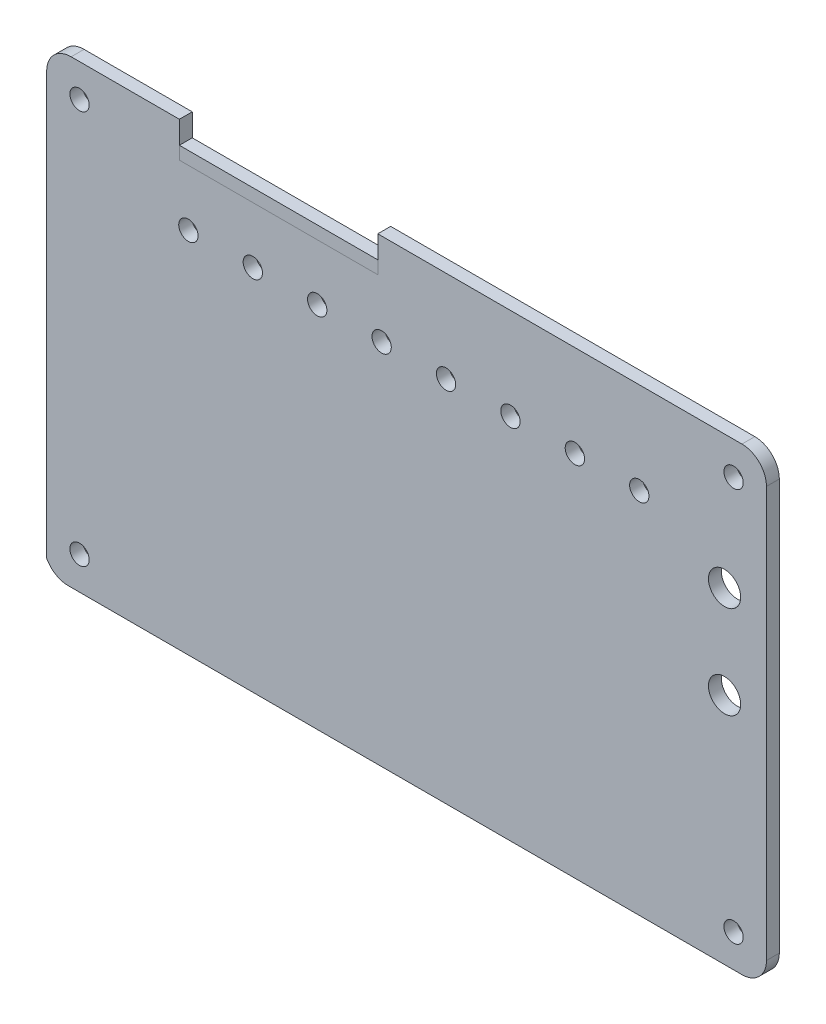
ISO-10303-21;
HEADER;
FILE_DESCRIPTION(('STEP AP214'),'2;1');
FILE_NAME('part.step','',(''),(''),'','','');
FILE_SCHEMA(('AUTOMOTIVE_DESIGN { 1 0 10303 214 1 1 1 1 }'));
ENDSEC;
DATA;
#1=APPLICATION_CONTEXT('core data for automotive mechanical design processes');
#2=APPLICATION_PROTOCOL_DEFINITION('international standard','automotive_design',2000,#1);
#3=PRODUCT_CONTEXT('',#1,'mechanical');
#4=PRODUCT('Part','Part','',(#3));
#5=PRODUCT_RELATED_PRODUCT_CATEGORY('part','',(#4));
#6=PRODUCT_DEFINITION_FORMATION('','',#4);
#7=PRODUCT_DEFINITION_CONTEXT('part definition',#1,'design');
#8=PRODUCT_DEFINITION('design','',#6,#7);
#9=PRODUCT_DEFINITION_SHAPE('','',#8);
#10=(LENGTH_UNIT() NAMED_UNIT(*) SI_UNIT(.MILLI.,.METRE.));
#11=(NAMED_UNIT(*) PLANE_ANGLE_UNIT() SI_UNIT($,.RADIAN.));
#12=(NAMED_UNIT(*) SI_UNIT($,.STERADIAN.) SOLID_ANGLE_UNIT());
#13=UNCERTAINTY_MEASURE_WITH_UNIT(LENGTH_MEASURE(1.E-05),#10,'distance_accuracy_value','');
#14=(GEOMETRIC_REPRESENTATION_CONTEXT(3) GLOBAL_UNCERTAINTY_ASSIGNED_CONTEXT((#13)) GLOBAL_UNIT_ASSIGNED_CONTEXT((#10,
#11,#12)) REPRESENTATION_CONTEXT('',''));
#15=CARTESIAN_POINT('',(0.,0.,0.));
#16=DIRECTION('',(0.,0.,1.));
#17=DIRECTION('',(1.,0.,0.));
#18=AXIS2_PLACEMENT_3D('',#15,#16,#17);
#19=CARTESIAN_POINT('',(-3.96613240239025,29.7904471176475,0.));
#20=DIRECTION('',(1.,0.,0.));
#21=DIRECTION('',(0.,0.,-1.));
#22=AXIS2_PLACEMENT_3D('',#19,#20,#21);
#23=PLANE('',#22);
#24=DIRECTION('',(0.,1.,0.));
#25=VECTOR('',#24,1.);
#26=CARTESIAN_POINT('',(-3.96613240239025,29.7904471176475,2.));
#27=LINE('',#26,#25);
#28=CARTESIAN_POINT('',(-3.96613240239025,29.7904471176475,2.));
#29=VERTEX_POINT('',#28);
#30=CARTESIAN_POINT('',(-3.96613240239025,31.7904471176475,2.));
#31=VERTEX_POINT('',#30);
#32=EDGE_CURVE('E107',#29,#31,#27,.T.);
#33=ORIENTED_EDGE('',*,*,#32,.F.);
#34=DIRECTION('',(0.,0.,1.));
#35=VECTOR('',#34,1.);
#36=CARTESIAN_POINT('',(-3.96613240239025,29.7904471176475,0.));
#37=LINE('',#36,#35);
#38=CARTESIAN_POINT('',(-3.96613240239025,29.7904471176475,0.));
#39=VERTEX_POINT('',#38);
#40=EDGE_CURVE('E12',#39,#29,#37,.T.);
#41=ORIENTED_EDGE('',*,*,#40,.F.);
#42=DIRECTION('',(0.,1.,0.));
#43=VECTOR('',#42,1.);
#44=CARTESIAN_POINT('',(-3.96613240239025,29.7904471176475,0.));
#45=LINE('',#44,#43);
#46=CARTESIAN_POINT('',(-3.96613240239025,31.7904471176475,0.));
#47=VERTEX_POINT('',#46);
#48=EDGE_CURVE('E101',#39,#47,#45,.T.);
#49=ORIENTED_EDGE('',*,*,#48,.T.);
#50=DIRECTION('',(0.,0.,1.));
#51=VECTOR('',#50,1.);
#52=CARTESIAN_POINT('',(-3.96613240239025,31.7904471176475,0.));
#53=LINE('',#52,#51);
#54=EDGE_CURVE('E46',#47,#31,#53,.T.);
#55=ORIENTED_EDGE('',*,*,#54,.T.);
#56=EDGE_LOOP('',(#33,#41,#49,#55));
#57=FACE_BOUND('',#56,.T.);
#58=ADVANCED_FACE('F43',(#57),#23,.T.);
#59=CARTESIAN_POINT('',(-3.96613240239025,29.7904471176475,0.));
#60=DIRECTION('',(0.,-1.,0.));
#61=DIRECTION('',(0.,0.,-1.));
#62=AXIS2_PLACEMENT_3D('',#59,#60,#61);
#63=PLANE('',#62);
#64=DIRECTION('',(1.,0.,0.));
#65=VECTOR('',#64,1.);
#66=CARTESIAN_POINT('',(-3.96613240239025,29.7904471176475,2.));
#67=LINE('',#66,#65);
#68=CARTESIAN_POINT('',(-34.7661324023902,29.7904471176475,2.));
#69=VERTEX_POINT('',#68);
#70=EDGE_CURVE('E103',#69,#29,#67,.T.);
#71=ORIENTED_EDGE('',*,*,#70,.F.);
#72=DIRECTION('',(0.,0.,1.));
#73=VECTOR('',#72,1.);
#74=CARTESIAN_POINT('',(-34.7661324023902,29.7904471176475,0.));
#75=LINE('',#74,#73);
#76=CARTESIAN_POINT('',(-34.7661324023902,29.7904471176475,0.));
#77=VERTEX_POINT('',#76);
#78=EDGE_CURVE('E52',#77,#69,#75,.T.);
#79=ORIENTED_EDGE('',*,*,#78,.F.);
#80=DIRECTION('',(1.,0.,0.));
#81=VECTOR('',#80,1.);
#82=CARTESIAN_POINT('',(-3.96613240239025,29.7904471176475,0.));
#83=LINE('',#82,#81);
#84=EDGE_CURVE('E98',#77,#39,#83,.T.);
#85=ORIENTED_EDGE('',*,*,#84,.T.);
#86=ORIENTED_EDGE('',*,*,#40,.T.);
#87=EDGE_LOOP('',(#71,#79,#85,#86));
#88=FACE_BOUND('',#87,.T.);
#89=ADVANCED_FACE('F117',(#88),#63,.T.);
#90=CARTESIAN_POINT('',(-34.7661324023902,29.7904471176475,0.));
#91=DIRECTION('',(-1.,0.,0.));
#92=DIRECTION('',(0.,0.,1.));
#93=AXIS2_PLACEMENT_3D('',#90,#91,#92);
#94=PLANE('',#93);
#95=DIRECTION('',(0.,-1.,0.));
#96=VECTOR('',#95,1.);
#97=CARTESIAN_POINT('',(-34.7661324023902,29.7904471176475,2.));
#98=LINE('',#97,#96);
#99=CARTESIAN_POINT('',(-34.7661324023902,31.7904471176475,2.));
#100=VERTEX_POINT('',#99);
#101=EDGE_CURVE('E93',#100,#69,#98,.T.);
#102=ORIENTED_EDGE('',*,*,#101,.F.);
#103=DIRECTION('',(0.,0.,1.));
#104=VECTOR('',#103,1.);
#105=CARTESIAN_POINT('',(-34.7661324023902,31.7904471176475,0.));
#106=LINE('',#105,#104);
#107=CARTESIAN_POINT('',(-34.7661324023902,31.7904471176475,0.));
#108=VERTEX_POINT('',#107);
#109=EDGE_CURVE('E88',#108,#100,#106,.T.);
#110=ORIENTED_EDGE('',*,*,#109,.F.);
#111=DIRECTION('',(0.,-1.,0.));
#112=VECTOR('',#111,1.);
#113=CARTESIAN_POINT('',(-34.7661324023902,29.7904471176475,0.));
#114=LINE('',#113,#112);
#115=EDGE_CURVE('E91',#108,#77,#114,.T.);
#116=ORIENTED_EDGE('',*,*,#115,.T.);
#117=ORIENTED_EDGE('',*,*,#78,.T.);
#118=EDGE_LOOP('',(#102,#110,#116,#117));
#119=FACE_BOUND('',#118,.T.);
#120=ADVANCED_FACE('F90',(#119),#94,.T.);
#121=CARTESIAN_POINT('',(-3.96613240239025,31.7904471176475,0.));
#122=DIRECTION('',(0.,1.,0.));
#123=DIRECTION('',(-1.,0.,0.));
#124=AXIS2_PLACEMENT_3D('',#121,#122,#123);
#125=PLANE('',#124);
#126=DIRECTION('',(-1.,0.,0.));
#127=VECTOR('',#126,1.);
#128=CARTESIAN_POINT('',(-3.96613240239025,31.7904471176475,2.));
#129=LINE('',#128,#127);
#130=EDGE_CURVE('E110',#31,#100,#129,.T.);
#131=ORIENTED_EDGE('',*,*,#130,.F.);
#132=ORIENTED_EDGE('',*,*,#54,.F.);
#133=DIRECTION('',(-1.,0.,0.));
#134=VECTOR('',#133,1.);
#135=CARTESIAN_POINT('',(-3.96613240239025,31.7904471176475,0.));
#136=LINE('',#135,#134);
#137=EDGE_CURVE('E97',#47,#108,#136,.T.);
#138=ORIENTED_EDGE('',*,*,#137,.T.);
#139=ORIENTED_EDGE('',*,*,#109,.T.);
#140=EDGE_LOOP('',(#131,#132,#138,#139));
#141=FACE_BOUND('',#140,.T.);
#142=ADVANCED_FACE('F100',(#141),#125,.T.);
#143=CARTESIAN_POINT('',(0.,0.,0.));
#144=DIRECTION('',(0.,0.,1.));
#145=DIRECTION('',(1.,0.,0.));
#146=AXIS2_PLACEMENT_3D('',#143,#144,#145);
#147=PLANE('',#146);
#148=ORIENTED_EDGE('',*,*,#48,.F.);
#149=ORIENTED_EDGE('',*,*,#84,.F.);
#150=ORIENTED_EDGE('',*,*,#115,.F.);
#151=ORIENTED_EDGE('',*,*,#137,.F.);
#152=EDGE_LOOP('',(#148,#149,#150,#151));
#153=FACE_BOUND('',#152,.T.);
#154=ADVANCED_FACE('F96',(#153),#147,.F.);
#155=CARTESIAN_POINT('',(0.,0.,2.));
#156=DIRECTION('',(0.,0.,1.));
#157=DIRECTION('',(1.,0.,0.));
#158=AXIS2_PLACEMENT_3D('',#155,#156,#157);
#159=PLANE('',#158);
#160=ORIENTED_EDGE('',*,*,#32,.T.);
#161=ORIENTED_EDGE('',*,*,#130,.T.);
#162=ORIENTED_EDGE('',*,*,#101,.T.);
#163=ORIENTED_EDGE('',*,*,#70,.T.);
#164=EDGE_LOOP('',(#160,#161,#162,#163));
#165=FACE_BOUND('',#164,.T.);
#166=ADVANCED_FACE('F116',(#165),#159,.T.);
#167=CLOSED_SHELL('',(#58,#89,#120,#142,#154,#166));
#168=MANIFOLD_SOLID_BREP('B2',#167);
#169=CARTESIAN_POINT('',(-52.0194922962539,-32.2495528823525,2.));
#170=DIRECTION('',(0.,0.,1.));
#171=DIRECTION('',(1.,0.,0.));
#172=AXIS2_PLACEMENT_3D('',#169,#170,#171);
#173=PLANE('',#172);
#174=CARTESIAN_POINT('',(49.8738675976098,0.181573060785537,2.));
#175=DIRECTION('',(0.,0.,1.));
#176=DIRECTION('',(1.,0.,0.));
#177=AXIS2_PLACEMENT_3D('',#174,#175,#176);
#178=CIRCLE('',#177,2.5);
#179=CARTESIAN_POINT('',(52.3738675976098,0.181573060785537,2.));
#180=VERTEX_POINT('',#179);
#181=EDGE_CURVE('E325',#180,#180,#178,.T.);
#182=ORIENTED_EDGE('',*,*,#181,.F.);
#183=EDGE_LOOP('',(#182));
#184=FACE_BOUND('',#183,.T.);
#185=CARTESIAN_POINT('',(49.8738675976098,14.5904471176475,2.));
#186=DIRECTION('',(0.,0.,1.));
#187=DIRECTION('',(1.,0.,0.));
#188=AXIS2_PLACEMENT_3D('',#185,#186,#187);
#189=CIRCLE('',#188,2.5);
#190=CARTESIAN_POINT('',(52.3738675976098,14.5904471176475,2.));
#191=VERTEX_POINT('',#190);
#192=EDGE_CURVE('E316',#191,#191,#189,.T.);
#193=ORIENTED_EDGE('',*,*,#192,.F.);
#194=EDGE_LOOP('',(#193));
#195=FACE_BOUND('',#194,.T.);
#196=DIRECTION('',(-1.,0.,0.));
#197=VECTOR('',#196,1.);
#198=CARTESIAN_POINT('',(-33.3661324023902,29.7904471176475,2.));
#199=LINE('',#198,#197);
#200=CARTESIAN_POINT('',(-3.96613240239025,29.7904471176475,2.));
#201=VERTEX_POINT('',#200);
#202=CARTESIAN_POINT('',(-34.7661324023902,29.7904471176475,2.));
#203=VERTEX_POINT('',#202);
#204=EDGE_CURVE('E262',#201,#203,#199,.T.);
#205=ORIENTED_EDGE('',*,*,#204,.T.);
#206=DIRECTION('',(0.,-1.,0.));
#207=VECTOR('',#206,1.);
#208=CARTESIAN_POINT('',(-34.7661324023902,35.2904471176475,2.));
#209=LINE('',#208,#207);
#210=CARTESIAN_POINT('',(-34.7661324023902,35.2904471176475,2.));
#211=VERTEX_POINT('',#210);
#212=EDGE_CURVE('E260',#211,#203,#209,.T.);
#213=ORIENTED_EDGE('',*,*,#212,.F.);
#214=DIRECTION('',(-1.,0.,0.));
#215=VECTOR('',#214,1.);
#216=CARTESIAN_POINT('',(-51.5661324023902,35.2904471176475,2.));
#217=LINE('',#216,#215);
#218=CARTESIAN_POINT('',(-51.5661324023902,35.2904471176475,2.));
#219=VERTEX_POINT('',#218);
#220=EDGE_CURVE('E251',#211,#219,#217,.T.);
#221=ORIENTED_EDGE('',*,*,#220,.T.);
#222=CARTESIAN_POINT('',(-51.5661324023902,31.4904471176475,2.));
#223=DIRECTION('',(0.,0.,1.));
#224=DIRECTION('',(1.,0.,0.));
#225=AXIS2_PLACEMENT_3D('',#222,#223,#224);
#226=CIRCLE('',#225,3.8);
#227=CARTESIAN_POINT('',(-55.3661324023902,31.4904471176475,2.));
#228=VERTEX_POINT('',#227);
#229=EDGE_CURVE('E256',#219,#228,#226,.T.);
#230=ORIENTED_EDGE('',*,*,#229,.T.);
#231=DIRECTION('',(0.,-1.,0.));
#232=VECTOR('',#231,1.);
#233=CARTESIAN_POINT('',(-55.3661324023902,-34.0495528823525,2.));
#234=LINE('',#233,#232);
#235=CARTESIAN_POINT('',(-55.3661324023902,-34.0495528823525,2.));
#236=VERTEX_POINT('',#235);
#237=EDGE_CURVE('E193',#228,#236,#234,.T.);
#238=ORIENTED_EDGE('',*,*,#237,.T.);
#239=CARTESIAN_POINT('',(-52.0194922962539,-32.2495528823525,2.));
#240=DIRECTION('',(0.,0.,1.));
#241=DIRECTION('',(1.,0.,0.));
#242=AXIS2_PLACEMENT_3D('',#239,#240,#241);
#243=CIRCLE('',#242,3.8);
#244=CARTESIAN_POINT('',(-52.0194922962539,-36.0495528823525,2.));
#245=VERTEX_POINT('',#244);
#246=EDGE_CURVE('E302',#236,#245,#243,.T.);
#247=ORIENTED_EDGE('',*,*,#246,.T.);
#248=DIRECTION('',(1.,0.,0.));
#249=VECTOR('',#248,1.);
#250=CARTESIAN_POINT('',(-52.0194922962539,-36.0495528823525,2.));
#251=LINE('',#250,#249);
#252=CARTESIAN_POINT('',(52.5738675976098,-36.0495528823525,2.));
#253=VERTEX_POINT('',#252);
#254=EDGE_CURVE('E234',#245,#253,#251,.T.);
#255=ORIENTED_EDGE('',*,*,#254,.T.);
#256=CARTESIAN_POINT('',(52.5738675976098,-32.2495528823525,2.));
#257=DIRECTION('',(0.,0.,1.));
#258=DIRECTION('',(1.,0.,0.));
#259=AXIS2_PLACEMENT_3D('',#256,#257,#258);
#260=CIRCLE('',#259,3.8);
#261=CARTESIAN_POINT('',(56.3738675976098,-32.2495528823525,2.));
#262=VERTEX_POINT('',#261);
#263=EDGE_CURVE('E419',#253,#262,#260,.T.);
#264=ORIENTED_EDGE('',*,*,#263,.T.);
#265=DIRECTION('',(0.,1.,0.));
#266=VECTOR('',#265,1.);
#267=CARTESIAN_POINT('',(56.3738675976098,31.4904471176475,2.));
#268=LINE('',#267,#266);
#269=CARTESIAN_POINT('',(56.3738675976098,31.4904471176475,2.));
#270=VERTEX_POINT('',#269);
#271=EDGE_CURVE('E421',#262,#270,#268,.T.);
#272=ORIENTED_EDGE('',*,*,#271,.T.);
#273=CARTESIAN_POINT('',(52.5738675976098,31.4904471176475,2.));
#274=DIRECTION('',(0.,0.,1.));
#275=DIRECTION('',(1.,0.,0.));
#276=AXIS2_PLACEMENT_3D('',#273,#274,#275);
#277=CIRCLE('',#276,3.8);
#278=CARTESIAN_POINT('',(52.5738675976098,35.2904471176475,2.));
#279=VERTEX_POINT('',#278);
#280=EDGE_CURVE('E423',#270,#279,#277,.T.);
#281=ORIENTED_EDGE('',*,*,#280,.T.);
#282=DIRECTION('',(-1.,0.,0.));
#283=VECTOR('',#282,1.);
#284=CARTESIAN_POINT('',(-5.36613240239025,35.2904471176475,2.));
#285=LINE('',#284,#283);
#286=CARTESIAN_POINT('',(-3.96613240239025,35.2904471176475,2.));
#287=VERTEX_POINT('',#286);
#288=EDGE_CURVE('E425',#279,#287,#285,.T.);
#289=ORIENTED_EDGE('',*,*,#288,.T.);
#290=DIRECTION('',(0.,1.,0.));
#291=VECTOR('',#290,1.);
#292=CARTESIAN_POINT('',(-3.96613240239025,35.2904471176475,2.));
#293=LINE('',#292,#291);
#294=EDGE_CURVE('E333',#201,#287,#293,.T.);
#295=ORIENTED_EDGE('',*,*,#294,.F.);
#296=EDGE_LOOP('',(#205,#213,#221,#230,#238,#247,#255,#264,#272,#281,#289,#295));
#297=FACE_BOUND('',#296,.T.);
#298=CARTESIAN_POINT('',(-50.2661324023902,30.1904471176475,2.));
#299=DIRECTION('',(0.,0.,1.));
#300=DIRECTION('',(1.,0.,0.));
#301=AXIS2_PLACEMENT_3D('',#298,#299,#300);
#302=CIRCLE('',#301,1.5);
#303=CARTESIAN_POINT('',(-48.7661324023902,30.1904471176475,2.));
#304=VERTEX_POINT('',#303);
#305=EDGE_CURVE('E350',#304,#304,#302,.T.);
#306=ORIENTED_EDGE('',*,*,#305,.F.);
#307=EDGE_LOOP('',(#306));
#308=FACE_BOUND('',#307,.T.);
#309=CARTESIAN_POINT('',(36.6338675976098,21.0619993771424,2.));
#310=DIRECTION('',(0.,0.,1.));
#311=DIRECTION('',(1.,0.,0.));
#312=AXIS2_PLACEMENT_3D('',#309,#310,#311);
#313=CIRCLE('',#312,1.5);
#314=CARTESIAN_POINT('',(38.1338675976098,21.0619993771424,2.));
#315=VERTEX_POINT('',#314);
#316=EDGE_CURVE('E369',#315,#315,#313,.T.);
#317=ORIENTED_EDGE('',*,*,#316,.F.);
#318=EDGE_LOOP('',(#317));
#319=FACE_BOUND('',#318,.T.);
#320=CARTESIAN_POINT('',(26.6338675976098,21.0619993771424,2.));
#321=DIRECTION('',(0.,0.,1.));
#322=DIRECTION('',(1.,0.,0.));
#323=AXIS2_PLACEMENT_3D('',#320,#321,#322);
#324=CIRCLE('',#323,1.5);
#325=CARTESIAN_POINT('',(28.1338675976098,21.0619993771424,2.));
#326=VERTEX_POINT('',#325);
#327=EDGE_CURVE('E368',#326,#326,#324,.T.);
#328=ORIENTED_EDGE('',*,*,#327,.F.);
#329=EDGE_LOOP('',(#328));
#330=FACE_BOUND('',#329,.T.);
#331=CARTESIAN_POINT('',(51.2738675976098,30.1904471176475,2.));
#332=DIRECTION('',(0.,0.,1.));
#333=DIRECTION('',(1.,0.,0.));
#334=AXIS2_PLACEMENT_3D('',#331,#332,#333);
#335=CIRCLE('',#334,1.5);
#336=CARTESIAN_POINT('',(52.7738675976098,30.1904471176475,2.));
#337=VERTEX_POINT('',#336);
#338=EDGE_CURVE('E351',#337,#337,#335,.T.);
#339=ORIENTED_EDGE('',*,*,#338,.F.);
#340=EDGE_LOOP('',(#339));
#341=FACE_BOUND('',#340,.T.);
#342=CARTESIAN_POINT('',(51.2738675976098,-30.9495528823525,2.));
#343=DIRECTION('',(0.,0.,1.));
#344=DIRECTION('',(1.,0.,0.));
#345=AXIS2_PLACEMENT_3D('',#342,#343,#344);
#346=CIRCLE('',#345,1.5);
#347=CARTESIAN_POINT('',(52.7738675976098,-30.9495528823525,2.));
#348=VERTEX_POINT('',#347);
#349=EDGE_CURVE('E357',#348,#348,#346,.T.);
#350=ORIENTED_EDGE('',*,*,#349,.F.);
#351=EDGE_LOOP('',(#350));
#352=FACE_BOUND('',#351,.T.);
#353=CARTESIAN_POINT('',(-50.2661324023902,-30.9495528823525,2.));
#354=DIRECTION('',(0.,0.,1.));
#355=DIRECTION('',(1.,0.,0.));
#356=AXIS2_PLACEMENT_3D('',#353,#354,#355);
#357=CIRCLE('',#356,1.5);
#358=CARTESIAN_POINT('',(-48.7661324023902,-30.9495528823525,2.));
#359=VERTEX_POINT('',#358);
#360=EDGE_CURVE('E344',#359,#359,#357,.T.);
#361=ORIENTED_EDGE('',*,*,#360,.F.);
#362=EDGE_LOOP('',(#361));
#363=FACE_BOUND('',#362,.T.);
#364=CARTESIAN_POINT('',(16.6338675976098,21.0619993771424,2.));
#365=DIRECTION('',(0.,0.,1.));
#366=DIRECTION('',(1.,0.,0.));
#367=AXIS2_PLACEMENT_3D('',#364,#365,#366);
#368=CIRCLE('',#367,1.5);
#369=CARTESIAN_POINT('',(18.1338675976098,21.0619993771424,2.));
#370=VERTEX_POINT('',#369);
#371=EDGE_CURVE('E380',#370,#370,#368,.T.);
#372=ORIENTED_EDGE('',*,*,#371,.F.);
#373=EDGE_LOOP('',(#372));
#374=FACE_BOUND('',#373,.T.);
#375=CARTESIAN_POINT('',(6.63386759760976,21.0619993771424,2.));
#376=DIRECTION('',(0.,0.,1.));
#377=DIRECTION('',(1.,0.,0.));
#378=AXIS2_PLACEMENT_3D('',#375,#376,#377);
#379=CIRCLE('',#378,1.5);
#380=CARTESIAN_POINT('',(8.13386759760976,21.0619993771424,2.));
#381=VERTEX_POINT('',#380);
#382=EDGE_CURVE('E405',#381,#381,#379,.T.);
#383=ORIENTED_EDGE('',*,*,#382,.F.);
#384=EDGE_LOOP('',(#383));
#385=FACE_BOUND('',#384,.T.);
#386=CARTESIAN_POINT('',(-3.36613240239024,21.0619993771424,2.));
#387=DIRECTION('',(0.,0.,1.));
#388=DIRECTION('',(1.,0.,0.));
#389=AXIS2_PLACEMENT_3D('',#386,#387,#388);
#390=CIRCLE('',#389,1.5);
#391=CARTESIAN_POINT('',(-1.86613240239024,21.0619993771424,2.));
#392=VERTEX_POINT('',#391);
#393=EDGE_CURVE('E399',#392,#392,#390,.T.);
#394=ORIENTED_EDGE('',*,*,#393,.F.);
#395=EDGE_LOOP('',(#394));
#396=FACE_BOUND('',#395,.T.);
#397=CARTESIAN_POINT('',(-13.3661324023902,21.0619993771424,2.));
#398=DIRECTION('',(0.,0.,1.));
#399=DIRECTION('',(1.,0.,0.));
#400=AXIS2_PLACEMENT_3D('',#397,#398,#399);
#401=CIRCLE('',#400,1.5);
#402=CARTESIAN_POINT('',(-11.8661324023902,21.0619993771424,2.));
#403=VERTEX_POINT('',#402);
#404=EDGE_CURVE('E393',#403,#403,#401,.T.);
#405=ORIENTED_EDGE('',*,*,#404,.F.);
#406=EDGE_LOOP('',(#405));
#407=FACE_BOUND('',#406,.T.);
#408=CARTESIAN_POINT('',(-23.3661324023902,21.0619993771424,2.));
#409=DIRECTION('',(0.,0.,1.));
#410=DIRECTION('',(1.,0.,0.));
#411=AXIS2_PLACEMENT_3D('',#408,#409,#410);
#412=CIRCLE('',#411,1.5);
#413=CARTESIAN_POINT('',(-21.8661324023902,21.0619993771424,2.));
#414=VERTEX_POINT('',#413);
#415=EDGE_CURVE('E387',#414,#414,#412,.T.);
#416=ORIENTED_EDGE('',*,*,#415,.F.);
#417=EDGE_LOOP('',(#416));
#418=FACE_BOUND('',#417,.T.);
#419=CARTESIAN_POINT('',(-33.3661324023902,21.0619993771424,2.));
#420=DIRECTION('',(0.,0.,1.));
#421=DIRECTION('',(1.,0.,0.));
#422=AXIS2_PLACEMENT_3D('',#419,#420,#421);
#423=CIRCLE('',#422,1.5);
#424=CARTESIAN_POINT('',(-31.8661324023902,21.0619993771424,2.));
#425=VERTEX_POINT('',#424);
#426=EDGE_CURVE('E386',#425,#425,#423,.T.);
#427=ORIENTED_EDGE('',*,*,#426,.F.);
#428=EDGE_LOOP('',(#427));
#429=FACE_BOUND('',#428,.T.);
#430=ADVANCED_FACE('F167',(#184,#195,#297,#308,#319,#330,#341,#352,#363,#374,#385,#396,#407,
#418,#429),#173,.T.);
#431=CARTESIAN_POINT('',(-52.0194922962539,-32.2495528823525,0.));
#432=DIRECTION('',(0.,0.,1.));
#433=DIRECTION('',(1.,0.,0.));
#434=AXIS2_PLACEMENT_3D('',#431,#432,#433);
#435=PLANE('',#434);
#436=CARTESIAN_POINT('',(49.8738675976098,0.181573060785537,0.));
#437=DIRECTION('',(0.,0.,1.));
#438=DIRECTION('',(1.,0.,0.));
#439=AXIS2_PLACEMENT_3D('',#436,#437,#438);
#440=CIRCLE('',#439,2.5);
#441=CARTESIAN_POINT('',(52.3738675976098,0.181573060785537,0.));
#442=VERTEX_POINT('',#441);
#443=EDGE_CURVE('E171',#442,#442,#440,.T.);
#444=ORIENTED_EDGE('',*,*,#443,.T.);
#445=EDGE_LOOP('',(#444));
#446=FACE_BOUND('',#445,.T.);
#447=CARTESIAN_POINT('',(49.8738675976098,14.5904471176475,0.));
#448=DIRECTION('',(0.,0.,1.));
#449=DIRECTION('',(1.,0.,0.));
#450=AXIS2_PLACEMENT_3D('',#447,#448,#449);
#451=CIRCLE('',#450,2.5);
#452=CARTESIAN_POINT('',(52.3738675976098,14.5904471176475,0.));
#453=VERTEX_POINT('',#452);
#454=EDGE_CURVE('E314',#453,#453,#451,.T.);
#455=ORIENTED_EDGE('',*,*,#454,.T.);
#456=EDGE_LOOP('',(#455));
#457=FACE_BOUND('',#456,.T.);
#458=CARTESIAN_POINT('',(-50.2661324023902,30.1904471176475,0.));
#459=DIRECTION('',(0.,0.,1.));
#460=DIRECTION('',(1.,0.,0.));
#461=AXIS2_PLACEMENT_3D('',#458,#459,#460);
#462=CIRCLE('',#461,1.5);
#463=CARTESIAN_POINT('',(-48.7661324023902,30.1904471176475,0.));
#464=VERTEX_POINT('',#463);
#465=EDGE_CURVE('E372',#464,#464,#462,.T.);
#466=ORIENTED_EDGE('',*,*,#465,.T.);
#467=EDGE_LOOP('',(#466));
#468=FACE_BOUND('',#467,.T.);
#469=CARTESIAN_POINT('',(36.6338675976098,21.0619993771424,0.));
#470=DIRECTION('',(0.,0.,1.));
#471=DIRECTION('',(1.,0.,0.));
#472=AXIS2_PLACEMENT_3D('',#469,#470,#471);
#473=CIRCLE('',#472,1.5);
#474=CARTESIAN_POINT('',(38.1338675976098,21.0619993771424,0.));
#475=VERTEX_POINT('',#474);
#476=EDGE_CURVE('E365',#475,#475,#473,.T.);
#477=ORIENTED_EDGE('',*,*,#476,.T.);
#478=EDGE_LOOP('',(#477));
#479=FACE_BOUND('',#478,.T.);
#480=CARTESIAN_POINT('',(26.6338675976098,21.0619993771424,0.));
#481=DIRECTION('',(0.,0.,1.));
#482=DIRECTION('',(1.,0.,0.));
#483=AXIS2_PLACEMENT_3D('',#480,#481,#482);
#484=CIRCLE('',#483,1.5);
#485=CARTESIAN_POINT('',(28.1338675976098,21.0619993771424,0.));
#486=VERTEX_POINT('',#485);
#487=EDGE_CURVE('E377',#486,#486,#484,.T.);
#488=ORIENTED_EDGE('',*,*,#487,.T.);
#489=EDGE_LOOP('',(#488));
#490=FACE_BOUND('',#489,.T.);
#491=CARTESIAN_POINT('',(51.2738675976098,30.1904471176475,0.));
#492=DIRECTION('',(0.,0.,1.));
#493=DIRECTION('',(1.,0.,0.));
#494=AXIS2_PLACEMENT_3D('',#491,#492,#493);
#495=CIRCLE('',#494,1.5);
#496=CARTESIAN_POINT('',(52.7738675976098,30.1904471176475,0.));
#497=VERTEX_POINT('',#496);
#498=EDGE_CURVE('E347',#497,#497,#495,.T.);
#499=ORIENTED_EDGE('',*,*,#498,.T.);
#500=EDGE_LOOP('',(#499));
#501=FACE_BOUND('',#500,.T.);
#502=CARTESIAN_POINT('',(51.2738675976098,-30.9495528823525,0.));
#503=DIRECTION('',(0.,0.,1.));
#504=DIRECTION('',(1.,0.,0.));
#505=AXIS2_PLACEMENT_3D('',#502,#503,#504);
#506=CIRCLE('',#505,1.5);
#507=CARTESIAN_POINT('',(52.7738675976098,-30.9495528823525,0.));
#508=VERTEX_POINT('',#507);
#509=EDGE_CURVE('E354',#508,#508,#506,.T.);
#510=ORIENTED_EDGE('',*,*,#509,.T.);
#511=EDGE_LOOP('',(#510));
#512=FACE_BOUND('',#511,.T.);
#513=CARTESIAN_POINT('',(-50.2661324023902,-30.9495528823525,0.));
#514=DIRECTION('',(0.,0.,1.));
#515=DIRECTION('',(1.,0.,0.));
#516=AXIS2_PLACEMENT_3D('',#513,#514,#515);
#517=CIRCLE('',#516,1.5);
#518=CARTESIAN_POINT('',(-48.7661324023902,-30.9495528823525,0.));
#519=VERTEX_POINT('',#518);
#520=EDGE_CURVE('E360',#519,#519,#517,.T.);
#521=ORIENTED_EDGE('',*,*,#520,.T.);
#522=EDGE_LOOP('',(#521));
#523=FACE_BOUND('',#522,.T.);
#524=CARTESIAN_POINT('',(16.6338675976098,21.0619993771424,0.));
#525=DIRECTION('',(0.,0.,1.));
#526=DIRECTION('',(1.,0.,0.));
#527=AXIS2_PLACEMENT_3D('',#524,#525,#526);
#528=CIRCLE('',#527,1.5);
#529=CARTESIAN_POINT('',(18.1338675976098,21.0619993771424,0.));
#530=VERTEX_POINT('',#529);
#531=EDGE_CURVE('E408',#530,#530,#528,.T.);
#532=ORIENTED_EDGE('',*,*,#531,.T.);
#533=EDGE_LOOP('',(#532));
#534=FACE_BOUND('',#533,.T.);
#535=CARTESIAN_POINT('',(6.63386759760976,21.0619993771424,0.));
#536=DIRECTION('',(0.,0.,1.));
#537=DIRECTION('',(1.,0.,0.));
#538=AXIS2_PLACEMENT_3D('',#535,#536,#537);
#539=CIRCLE('',#538,1.5);
#540=CARTESIAN_POINT('',(8.13386759760976,21.0619993771424,0.));
#541=VERTEX_POINT('',#540);
#542=EDGE_CURVE('E402',#541,#541,#539,.T.);
#543=ORIENTED_EDGE('',*,*,#542,.T.);
#544=EDGE_LOOP('',(#543));
#545=FACE_BOUND('',#544,.T.);
#546=CARTESIAN_POINT('',(-3.36613240239024,21.0619993771424,0.));
#547=DIRECTION('',(0.,0.,1.));
#548=DIRECTION('',(1.,0.,0.));
#549=AXIS2_PLACEMENT_3D('',#546,#547,#548);
#550=CIRCLE('',#549,1.5);
#551=CARTESIAN_POINT('',(-1.86613240239024,21.0619993771424,0.));
#552=VERTEX_POINT('',#551);
#553=EDGE_CURVE('E396',#552,#552,#550,.T.);
#554=ORIENTED_EDGE('',*,*,#553,.T.);
#555=EDGE_LOOP('',(#554));
#556=FACE_BOUND('',#555,.T.);
#557=CARTESIAN_POINT('',(-13.3661324023902,21.0619993771424,0.));
#558=DIRECTION('',(0.,0.,1.));
#559=DIRECTION('',(1.,0.,0.));
#560=AXIS2_PLACEMENT_3D('',#557,#558,#559);
#561=CIRCLE('',#560,1.5);
#562=CARTESIAN_POINT('',(-11.8661324023902,21.0619993771424,0.));
#563=VERTEX_POINT('',#562);
#564=EDGE_CURVE('E390',#563,#563,#561,.T.);
#565=ORIENTED_EDGE('',*,*,#564,.T.);
#566=EDGE_LOOP('',(#565));
#567=FACE_BOUND('',#566,.T.);
#568=CARTESIAN_POINT('',(-23.3661324023902,21.0619993771424,0.));
#569=DIRECTION('',(0.,0.,1.));
#570=DIRECTION('',(1.,0.,0.));
#571=AXIS2_PLACEMENT_3D('',#568,#569,#570);
#572=CIRCLE('',#571,1.5);
#573=CARTESIAN_POINT('',(-21.8661324023902,21.0619993771424,0.));
#574=VERTEX_POINT('',#573);
#575=EDGE_CURVE('E383',#574,#574,#572,.T.);
#576=ORIENTED_EDGE('',*,*,#575,.T.);
#577=EDGE_LOOP('',(#576));
#578=FACE_BOUND('',#577,.T.);
#579=CARTESIAN_POINT('',(-33.3661324023902,21.0619993771424,0.));
#580=DIRECTION('',(0.,0.,1.));
#581=DIRECTION('',(1.,0.,0.));
#582=AXIS2_PLACEMENT_3D('',#579,#580,#581);
#583=CIRCLE('',#582,1.5);
#584=CARTESIAN_POINT('',(-31.8661324023902,21.0619993771424,0.));
#585=VERTEX_POINT('',#584);
#586=EDGE_CURVE('E284',#585,#585,#583,.T.);
#587=ORIENTED_EDGE('',*,*,#586,.T.);
#588=EDGE_LOOP('',(#587));
#589=FACE_BOUND('',#588,.T.);
#590=DIRECTION('',(0.,-1.,0.));
#591=VECTOR('',#590,1.);
#592=CARTESIAN_POINT('',(-34.7661324023902,35.2904471176475,0.));
#593=LINE('',#592,#591);
#594=CARTESIAN_POINT('',(-34.7661324023902,35.2904471176475,0.));
#595=VERTEX_POINT('',#594);
#596=CARTESIAN_POINT('',(-34.7661324023902,29.7904471176475,0.));
#597=VERTEX_POINT('',#596);
#598=EDGE_CURVE('E184',#595,#597,#593,.T.);
#599=ORIENTED_EDGE('',*,*,#598,.T.);
#600=DIRECTION('',(-1.,0.,0.));
#601=VECTOR('',#600,1.);
#602=CARTESIAN_POINT('',(-33.3661324023902,29.7904471176475,0.));
#603=LINE('',#602,#601);
#604=CARTESIAN_POINT('',(-3.96613240239025,29.7904471176475,0.));
#605=VERTEX_POINT('',#604);
#606=EDGE_CURVE('E295',#605,#597,#603,.T.);
#607=ORIENTED_EDGE('',*,*,#606,.F.);
#608=DIRECTION('',(0.,1.,0.));
#609=VECTOR('',#608,1.);
#610=CARTESIAN_POINT('',(-3.96613240239025,35.2904471176475,0.));
#611=LINE('',#610,#609);
#612=CARTESIAN_POINT('',(-3.96613240239025,35.2904471176475,0.));
#613=VERTEX_POINT('',#612);
#614=EDGE_CURVE('E335',#605,#613,#611,.T.);
#615=ORIENTED_EDGE('',*,*,#614,.T.);
#616=DIRECTION('',(-1.,0.,0.));
#617=VECTOR('',#616,1.);
#618=CARTESIAN_POINT('',(-5.36613240239025,35.2904471176475,0.));
#619=LINE('',#618,#617);
#620=CARTESIAN_POINT('',(52.5738675976098,35.2904471176475,0.));
#621=VERTEX_POINT('',#620);
#622=EDGE_CURVE('E292',#621,#613,#619,.T.);
#623=ORIENTED_EDGE('',*,*,#622,.F.);
#624=CARTESIAN_POINT('',(52.5738675976098,31.4904471176475,0.));
#625=DIRECTION('',(0.,0.,1.));
#626=DIRECTION('',(1.,0.,0.));
#627=AXIS2_PLACEMENT_3D('',#624,#625,#626);
#628=CIRCLE('',#627,3.8);
#629=CARTESIAN_POINT('',(56.3738675976098,31.4904471176475,0.));
#630=VERTEX_POINT('',#629);
#631=EDGE_CURVE('E290',#630,#621,#628,.T.);
#632=ORIENTED_EDGE('',*,*,#631,.F.);
#633=DIRECTION('',(0.,1.,0.));
#634=VECTOR('',#633,1.);
#635=CARTESIAN_POINT('',(56.3738675976098,31.4904471176475,0.));
#636=LINE('',#635,#634);
#637=CARTESIAN_POINT('',(56.3738675976098,-32.2495528823525,0.));
#638=VERTEX_POINT('',#637);
#639=EDGE_CURVE('E288',#638,#630,#636,.T.);
#640=ORIENTED_EDGE('',*,*,#639,.F.);
#641=CARTESIAN_POINT('',(52.5738675976098,-32.2495528823525,0.));
#642=DIRECTION('',(0.,0.,1.));
#643=DIRECTION('',(1.,0.,0.));
#644=AXIS2_PLACEMENT_3D('',#641,#642,#643);
#645=CIRCLE('',#644,3.8);
#646=CARTESIAN_POINT('',(52.5738675976098,-36.0495528823525,0.));
#647=VERTEX_POINT('',#646);
#648=EDGE_CURVE('E286',#647,#638,#645,.T.);
#649=ORIENTED_EDGE('',*,*,#648,.F.);
#650=DIRECTION('',(1.,0.,0.));
#651=VECTOR('',#650,1.);
#652=CARTESIAN_POINT('',(48.5238675976098,-36.0495528823525,0.));
#653=LINE('',#652,#651);
#654=CARTESIAN_POINT('',(-52.0194922962539,-36.0495528823525,0.));
#655=VERTEX_POINT('',#654);
#656=EDGE_CURVE('E283',#655,#647,#653,.T.);
#657=ORIENTED_EDGE('',*,*,#656,.F.);
#658=CARTESIAN_POINT('',(-52.0194922962539,-32.2495528823525,0.));
#659=DIRECTION('',(0.,0.,1.));
#660=DIRECTION('',(1.,0.,0.));
#661=AXIS2_PLACEMENT_3D('',#658,#659,#660);
#662=CIRCLE('',#661,3.8);
#663=CARTESIAN_POINT('',(-55.3661324023902,-34.0495528823525,0.));
#664=VERTEX_POINT('',#663);
#665=EDGE_CURVE('E280',#664,#655,#662,.T.);
#666=ORIENTED_EDGE('',*,*,#665,.F.);
#667=DIRECTION('',(0.,-1.,0.));
#668=VECTOR('',#667,1.);
#669=CARTESIAN_POINT('',(-55.3661324023902,-34.0495528823525,0.));
#670=LINE('',#669,#668);
#671=CARTESIAN_POINT('',(-55.3661324023902,31.4904471176475,0.));
#672=VERTEX_POINT('',#671);
#673=EDGE_CURVE('E226',#672,#664,#670,.T.);
#674=ORIENTED_EDGE('',*,*,#673,.F.);
#675=CARTESIAN_POINT('',(-51.5661324023902,31.4904471176475,0.));
#676=DIRECTION('',(0.,0.,1.));
#677=DIRECTION('',(1.,0.,0.));
#678=AXIS2_PLACEMENT_3D('',#675,#676,#677);
#679=CIRCLE('',#678,3.8);
#680=CARTESIAN_POINT('',(-51.5661324023902,35.2904471176475,0.));
#681=VERTEX_POINT('',#680);
#682=EDGE_CURVE('E299',#681,#672,#679,.T.);
#683=ORIENTED_EDGE('',*,*,#682,.F.);
#684=DIRECTION('',(-1.,0.,0.));
#685=VECTOR('',#684,1.);
#686=CARTESIAN_POINT('',(-51.5661324023902,35.2904471176475,0.));
#687=LINE('',#686,#685);
#688=EDGE_CURVE('E268',#595,#681,#687,.T.);
#689=ORIENTED_EDGE('',*,*,#688,.F.);
#690=EDGE_LOOP('',(#599,#607,#615,#623,#632,#640,#649,#657,#666,#674,#683,#689));
#691=FACE_BOUND('',#690,.T.);
#692=ADVANCED_FACE('F440',(#446,#457,#468,#479,#490,#501,#512,#523,#534,#545,#556,#567,#578,
#589,#691),#435,.F.);
#693=CARTESIAN_POINT('',(-52.0194922962539,-32.2495528823525,2.));
#694=DIRECTION('',(0.,0.,-1.));
#695=DIRECTION('',(-1.,0.,0.));
#696=AXIS2_PLACEMENT_3D('',#693,#694,#695);
#697=CYLINDRICAL_SURFACE('',#696,3.8);
#698=ORIENTED_EDGE('',*,*,#665,.T.);
#699=DIRECTION('',(0.,0.,-1.));
#700=VECTOR('',#699,1.);
#701=CARTESIAN_POINT('',(-52.0194922962539,-36.0495528823525,2.));
#702=LINE('',#701,#700);
#703=EDGE_CURVE('E41',#245,#655,#702,.T.);
#704=ORIENTED_EDGE('',*,*,#703,.F.);
#705=ORIENTED_EDGE('',*,*,#246,.F.);
#706=DIRECTION('',(0.,0.,-1.));
#707=VECTOR('',#706,1.);
#708=CARTESIAN_POINT('',(-55.3661324023902,-34.0495528823525,2.));
#709=LINE('',#708,#707);
#710=EDGE_CURVE('E276',#236,#664,#709,.T.);
#711=ORIENTED_EDGE('',*,*,#710,.T.);
#712=EDGE_LOOP('',(#698,#704,#705,#711));
#713=FACE_BOUND('',#712,.T.);
#714=ADVANCED_FACE('F169',(#713),#697,.T.);
#715=CARTESIAN_POINT('',(48.5238675976098,-36.0495528823525,2.));
#716=DIRECTION('',(0.,1.,0.));
#717=DIRECTION('',(0.,0.,1.));
#718=AXIS2_PLACEMENT_3D('',#715,#716,#717);
#719=PLANE('',#718);
#720=ORIENTED_EDGE('',*,*,#656,.T.);
#721=DIRECTION('',(0.,0.,-1.));
#722=VECTOR('',#721,1.);
#723=CARTESIAN_POINT('',(52.5738675976098,-36.0495528823525,2.));
#724=LINE('',#723,#722);
#725=EDGE_CURVE('E176',#253,#647,#724,.T.);
#726=ORIENTED_EDGE('',*,*,#725,.F.);
#727=ORIENTED_EDGE('',*,*,#254,.F.);
#728=ORIENTED_EDGE('',*,*,#703,.T.);
#729=EDGE_LOOP('',(#720,#726,#727,#728));
#730=FACE_BOUND('',#729,.T.);
#731=ADVANCED_FACE('F448',(#730),#719,.F.);
#732=CARTESIAN_POINT('',(52.5738675976098,-32.2495528823525,2.));
#733=DIRECTION('',(0.,0.,-1.));
#734=DIRECTION('',(-1.,0.,0.));
#735=AXIS2_PLACEMENT_3D('',#732,#733,#734);
#736=CYLINDRICAL_SURFACE('',#735,3.8);
#737=ORIENTED_EDGE('',*,*,#648,.T.);
#738=DIRECTION('',(0.,0.,-1.));
#739=VECTOR('',#738,1.);
#740=CARTESIAN_POINT('',(56.3738675976098,-32.2495528823525,2.));
#741=LINE('',#740,#739);
#742=EDGE_CURVE('E310',#262,#638,#741,.T.);
#743=ORIENTED_EDGE('',*,*,#742,.F.);
#744=ORIENTED_EDGE('',*,*,#263,.F.);
#745=ORIENTED_EDGE('',*,*,#725,.T.);
#746=EDGE_LOOP('',(#737,#743,#744,#745));
#747=FACE_BOUND('',#746,.T.);
#748=ADVANCED_FACE('F451',(#747),#736,.T.);
#749=CARTESIAN_POINT('',(56.3738675976098,31.4904471176475,2.));
#750=DIRECTION('',(-1.,0.,0.));
#751=DIRECTION('',(0.,-1.,0.));
#752=AXIS2_PLACEMENT_3D('',#749,#750,#751);
#753=PLANE('',#752);
#754=ORIENTED_EDGE('',*,*,#639,.T.);
#755=DIRECTION('',(0.,0.,-1.));
#756=VECTOR('',#755,1.);
#757=CARTESIAN_POINT('',(56.3738675976098,31.4904471176475,2.));
#758=LINE('',#757,#756);
#759=EDGE_CURVE('E307',#270,#630,#758,.T.);
#760=ORIENTED_EDGE('',*,*,#759,.F.);
#761=ORIENTED_EDGE('',*,*,#271,.F.);
#762=ORIENTED_EDGE('',*,*,#742,.T.);
#763=EDGE_LOOP('',(#754,#760,#761,#762));
#764=FACE_BOUND('',#763,.T.);
#765=ADVANCED_FACE('F456',(#764),#753,.F.);
#766=CARTESIAN_POINT('',(52.5738675976098,31.4904471176475,2.));
#767=DIRECTION('',(0.,0.,-1.));
#768=DIRECTION('',(-1.,0.,0.));
#769=AXIS2_PLACEMENT_3D('',#766,#767,#768);
#770=CYLINDRICAL_SURFACE('',#769,3.8);
#771=ORIENTED_EDGE('',*,*,#631,.T.);
#772=DIRECTION('',(0.,0.,-1.));
#773=VECTOR('',#772,1.);
#774=CARTESIAN_POINT('',(52.5738675976098,35.2904471176475,2.));
#775=LINE('',#774,#773);
#776=EDGE_CURVE('E271',#279,#621,#775,.T.);
#777=ORIENTED_EDGE('',*,*,#776,.F.);
#778=ORIENTED_EDGE('',*,*,#280,.F.);
#779=ORIENTED_EDGE('',*,*,#759,.T.);
#780=EDGE_LOOP('',(#771,#777,#778,#779));
#781=FACE_BOUND('',#780,.T.);
#782=ADVANCED_FACE('F461',(#781),#770,.T.);
#783=CARTESIAN_POINT('',(-5.36613240239025,35.2904471176475,2.));
#784=DIRECTION('',(0.,-1.,0.));
#785=DIRECTION('',(0.,0.,-1.));
#786=AXIS2_PLACEMENT_3D('',#783,#784,#785);
#787=PLANE('',#786);
#788=ORIENTED_EDGE('',*,*,#622,.T.);
#789=DIRECTION('',(0.,0.,1.));
#790=VECTOR('',#789,1.);
#791=CARTESIAN_POINT('',(-3.96613240239025,35.2904471176475,0.));
#792=LINE('',#791,#790);
#793=EDGE_CURVE('E341',#613,#287,#792,.T.);
#794=ORIENTED_EDGE('',*,*,#793,.T.);
#795=ORIENTED_EDGE('',*,*,#288,.F.);
#796=ORIENTED_EDGE('',*,*,#776,.T.);
#797=EDGE_LOOP('',(#788,#794,#795,#796));
#798=FACE_BOUND('',#797,.T.);
#799=ADVANCED_FACE('F465',(#798),#787,.F.);
#800=CARTESIAN_POINT('',(-33.3661324023902,29.7904471176475,2.));
#801=DIRECTION('',(0.,-1.,0.));
#802=DIRECTION('',(0.,0.,-1.));
#803=AXIS2_PLACEMENT_3D('',#800,#801,#802);
#804=PLANE('',#803);
#805=ORIENTED_EDGE('',*,*,#606,.T.);
#806=DIRECTION('',(0.,0.,1.));
#807=VECTOR('',#806,1.);
#808=CARTESIAN_POINT('',(-34.7661324023902,29.7904471176475,0.));
#809=LINE('',#808,#807);
#810=EDGE_CURVE('E330',#597,#203,#809,.T.);
#811=ORIENTED_EDGE('',*,*,#810,.T.);
#812=ORIENTED_EDGE('',*,*,#204,.F.);
#813=DIRECTION('',(0.,0.,1.));
#814=VECTOR('',#813,1.);
#815=CARTESIAN_POINT('',(-3.96613240239025,29.7904471176475,0.));
#816=LINE('',#815,#814);
#817=EDGE_CURVE('E338',#605,#201,#816,.T.);
#818=ORIENTED_EDGE('',*,*,#817,.F.);
#819=EDGE_LOOP('',(#805,#811,#812,#818));
#820=FACE_BOUND('',#819,.T.);
#821=ADVANCED_FACE('F435',(#820),#804,.F.);
#822=CARTESIAN_POINT('',(-51.5661324023902,35.2904471176475,2.));
#823=DIRECTION('',(0.,-1.,0.));
#824=DIRECTION('',(0.,0.,-1.));
#825=AXIS2_PLACEMENT_3D('',#822,#823,#824);
#826=PLANE('',#825);
#827=ORIENTED_EDGE('',*,*,#220,.F.);
#828=DIRECTION('',(0.,0.,1.));
#829=VECTOR('',#828,1.);
#830=CARTESIAN_POINT('',(-34.7661324023902,35.2904471176475,0.));
#831=LINE('',#830,#829);
#832=EDGE_CURVE('E328',#595,#211,#831,.T.);
#833=ORIENTED_EDGE('',*,*,#832,.F.);
#834=ORIENTED_EDGE('',*,*,#688,.T.);
#835=DIRECTION('',(0.,0.,-1.));
#836=VECTOR('',#835,1.);
#837=CARTESIAN_POINT('',(-51.5661324023902,35.2904471176475,2.));
#838=LINE('',#837,#836);
#839=EDGE_CURVE('E265',#219,#681,#838,.T.);
#840=ORIENTED_EDGE('',*,*,#839,.F.);
#841=EDGE_LOOP('',(#827,#833,#834,#840));
#842=FACE_BOUND('',#841,.T.);
#843=ADVANCED_FACE('F266',(#842),#826,.F.);
#844=CARTESIAN_POINT('',(-51.5661324023902,31.4904471176475,2.));
#845=DIRECTION('',(0.,0.,-1.));
#846=DIRECTION('',(-1.,0.,0.));
#847=AXIS2_PLACEMENT_3D('',#844,#845,#846);
#848=CYLINDRICAL_SURFACE('',#847,3.8);
#849=ORIENTED_EDGE('',*,*,#682,.T.);
#850=DIRECTION('',(0.,0.,-1.));
#851=VECTOR('',#850,1.);
#852=CARTESIAN_POINT('',(-55.3661324023902,31.4904471176475,2.));
#853=LINE('',#852,#851);
#854=EDGE_CURVE('E272',#228,#672,#853,.T.);
#855=ORIENTED_EDGE('',*,*,#854,.F.);
#856=ORIENTED_EDGE('',*,*,#229,.F.);
#857=ORIENTED_EDGE('',*,*,#839,.T.);
#858=EDGE_LOOP('',(#849,#855,#856,#857));
#859=FACE_BOUND('',#858,.T.);
#860=ADVANCED_FACE('F274',(#859),#848,.T.);
#861=CARTESIAN_POINT('',(-55.3661324023902,-34.0495528823525,2.));
#862=DIRECTION('',(1.,0.,0.));
#863=DIRECTION('',(0.,1.,0.));
#864=AXIS2_PLACEMENT_3D('',#861,#862,#863);
#865=PLANE('',#864);
#866=ORIENTED_EDGE('',*,*,#673,.T.);
#867=ORIENTED_EDGE('',*,*,#710,.F.);
#868=ORIENTED_EDGE('',*,*,#237,.F.);
#869=ORIENTED_EDGE('',*,*,#854,.T.);
#870=EDGE_LOOP('',(#866,#867,#868,#869));
#871=FACE_BOUND('',#870,.T.);
#872=ADVANCED_FACE('F442',(#871),#865,.F.);
#873=CARTESIAN_POINT('',(-33.3661324023902,21.0619993771424,0.));
#874=DIRECTION('',(0.,0.,1.));
#875=DIRECTION('',(1.,0.,0.));
#876=AXIS2_PLACEMENT_3D('',#873,#874,#875);
#877=CYLINDRICAL_SURFACE('',#876,1.5);
#878=ORIENTED_EDGE('',*,*,#586,.F.);
#879=EDGE_LOOP('',(#878));
#880=FACE_BOUND('',#879,.T.);
#881=ORIENTED_EDGE('',*,*,#426,.T.);
#882=EDGE_LOOP('',(#881));
#883=FACE_BOUND('',#882,.T.);
#884=ADVANCED_FACE('F500',(#880,#883),#877,.F.);
#885=CARTESIAN_POINT('',(-23.3661324023902,21.0619993771424,0.));
#886=DIRECTION('',(0.,0.,1.));
#887=DIRECTION('',(1.,0.,0.));
#888=AXIS2_PLACEMENT_3D('',#885,#886,#887);
#889=CYLINDRICAL_SURFACE('',#888,1.5);
#890=ORIENTED_EDGE('',*,*,#575,.F.);
#891=EDGE_LOOP('',(#890));
#892=FACE_BOUND('',#891,.T.);
#893=ORIENTED_EDGE('',*,*,#415,.T.);
#894=EDGE_LOOP('',(#893));
#895=FACE_BOUND('',#894,.T.);
#896=ADVANCED_FACE('F584',(#892,#895),#889,.F.);
#897=CARTESIAN_POINT('',(-13.3661324023902,21.0619993771424,0.));
#898=DIRECTION('',(0.,0.,1.));
#899=DIRECTION('',(1.,0.,0.));
#900=AXIS2_PLACEMENT_3D('',#897,#898,#899);
#901=CYLINDRICAL_SURFACE('',#900,1.5);
#902=ORIENTED_EDGE('',*,*,#564,.F.);
#903=EDGE_LOOP('',(#902));
#904=FACE_BOUND('',#903,.T.);
#905=ORIENTED_EDGE('',*,*,#404,.T.);
#906=EDGE_LOOP('',(#905));
#907=FACE_BOUND('',#906,.T.);
#908=ADVANCED_FACE('F590',(#904,#907),#901,.F.);
#909=CARTESIAN_POINT('',(-3.36613240239024,21.0619993771424,0.));
#910=DIRECTION('',(0.,0.,1.));
#911=DIRECTION('',(1.,0.,0.));
#912=AXIS2_PLACEMENT_3D('',#909,#910,#911);
#913=CYLINDRICAL_SURFACE('',#912,1.5);
#914=ORIENTED_EDGE('',*,*,#553,.F.);
#915=EDGE_LOOP('',(#914));
#916=FACE_BOUND('',#915,.T.);
#917=ORIENTED_EDGE('',*,*,#393,.T.);
#918=EDGE_LOOP('',(#917));
#919=FACE_BOUND('',#918,.T.);
#920=ADVANCED_FACE('F596',(#916,#919),#913,.F.);
#921=CARTESIAN_POINT('',(6.63386759760976,21.0619993771424,0.));
#922=DIRECTION('',(0.,0.,1.));
#923=DIRECTION('',(1.,0.,0.));
#924=AXIS2_PLACEMENT_3D('',#921,#922,#923);
#925=CYLINDRICAL_SURFACE('',#924,1.5);
#926=ORIENTED_EDGE('',*,*,#542,.F.);
#927=EDGE_LOOP('',(#926));
#928=FACE_BOUND('',#927,.T.);
#929=ORIENTED_EDGE('',*,*,#382,.T.);
#930=EDGE_LOOP('',(#929));
#931=FACE_BOUND('',#930,.T.);
#932=ADVANCED_FACE('F605',(#928,#931),#925,.F.);
#933=CARTESIAN_POINT('',(16.6338675976098,21.0619993771424,0.));
#934=DIRECTION('',(0.,0.,1.));
#935=DIRECTION('',(1.,0.,0.));
#936=AXIS2_PLACEMENT_3D('',#933,#934,#935);
#937=CYLINDRICAL_SURFACE('',#936,1.5);
#938=ORIENTED_EDGE('',*,*,#531,.F.);
#939=EDGE_LOOP('',(#938));
#940=FACE_BOUND('',#939,.T.);
#941=ORIENTED_EDGE('',*,*,#371,.T.);
#942=EDGE_LOOP('',(#941));
#943=FACE_BOUND('',#942,.T.);
#944=ADVANCED_FACE('F608',(#940,#943),#937,.F.);
#945=CARTESIAN_POINT('',(-50.2661324023902,-30.9495528823525,0.));
#946=DIRECTION('',(0.,0.,1.));
#947=DIRECTION('',(1.,0.,0.));
#948=AXIS2_PLACEMENT_3D('',#945,#946,#947);
#949=CYLINDRICAL_SURFACE('',#948,1.5);
#950=ORIENTED_EDGE('',*,*,#520,.F.);
#951=EDGE_LOOP('',(#950));
#952=FACE_BOUND('',#951,.T.);
#953=ORIENTED_EDGE('',*,*,#360,.T.);
#954=EDGE_LOOP('',(#953));
#955=FACE_BOUND('',#954,.T.);
#956=ADVANCED_FACE('F611',(#952,#955),#949,.F.);
#957=CARTESIAN_POINT('',(51.2738675976098,-30.9495528823525,0.));
#958=DIRECTION('',(0.,0.,1.));
#959=DIRECTION('',(1.,0.,0.));
#960=AXIS2_PLACEMENT_3D('',#957,#958,#959);
#961=CYLINDRICAL_SURFACE('',#960,1.5);
#962=ORIENTED_EDGE('',*,*,#509,.F.);
#963=EDGE_LOOP('',(#962));
#964=FACE_BOUND('',#963,.T.);
#965=ORIENTED_EDGE('',*,*,#349,.T.);
#966=EDGE_LOOP('',(#965));
#967=FACE_BOUND('',#966,.T.);
#968=ADVANCED_FACE('F616',(#964,#967),#961,.F.);
#969=CARTESIAN_POINT('',(51.2738675976098,30.1904471176475,0.));
#970=DIRECTION('',(0.,0.,1.));
#971=DIRECTION('',(1.,0.,0.));
#972=AXIS2_PLACEMENT_3D('',#969,#970,#971);
#973=CYLINDRICAL_SURFACE('',#972,1.5);
#974=ORIENTED_EDGE('',*,*,#498,.F.);
#975=EDGE_LOOP('',(#974));
#976=FACE_BOUND('',#975,.T.);
#977=ORIENTED_EDGE('',*,*,#338,.T.);
#978=EDGE_LOOP('',(#977));
#979=FACE_BOUND('',#978,.T.);
#980=ADVANCED_FACE('F636',(#976,#979),#973,.F.);
#981=CARTESIAN_POINT('',(26.6338675976098,21.0619993771424,0.));
#982=DIRECTION('',(0.,0.,1.));
#983=DIRECTION('',(1.,0.,0.));
#984=AXIS2_PLACEMENT_3D('',#981,#982,#983);
#985=CYLINDRICAL_SURFACE('',#984,1.5);
#986=ORIENTED_EDGE('',*,*,#487,.F.);
#987=EDGE_LOOP('',(#986));
#988=FACE_BOUND('',#987,.T.);
#989=ORIENTED_EDGE('',*,*,#327,.T.);
#990=EDGE_LOOP('',(#989));
#991=FACE_BOUND('',#990,.T.);
#992=ADVANCED_FACE('F601',(#988,#991),#985,.F.);
#993=CARTESIAN_POINT('',(36.6338675976098,21.0619993771424,0.));
#994=DIRECTION('',(0.,0.,1.));
#995=DIRECTION('',(1.,0.,0.));
#996=AXIS2_PLACEMENT_3D('',#993,#994,#995);
#997=CYLINDRICAL_SURFACE('',#996,1.5);
#998=ORIENTED_EDGE('',*,*,#476,.F.);
#999=EDGE_LOOP('',(#998));
#1000=FACE_BOUND('',#999,.T.);
#1001=ORIENTED_EDGE('',*,*,#316,.T.);
#1002=EDGE_LOOP('',(#1001));
#1003=FACE_BOUND('',#1002,.T.);
#1004=ADVANCED_FACE('F484',(#1000,#1003),#997,.F.);
#1005=CARTESIAN_POINT('',(-50.2661324023902,30.1904471176475,0.));
#1006=DIRECTION('',(0.,0.,1.));
#1007=DIRECTION('',(1.,0.,0.));
#1008=AXIS2_PLACEMENT_3D('',#1005,#1006,#1007);
#1009=CYLINDRICAL_SURFACE('',#1008,1.5);
#1010=ORIENTED_EDGE('',*,*,#465,.F.);
#1011=EDGE_LOOP('',(#1010));
#1012=FACE_BOUND('',#1011,.T.);
#1013=ORIENTED_EDGE('',*,*,#305,.T.);
#1014=EDGE_LOOP('',(#1013));
#1015=FACE_BOUND('',#1014,.T.);
#1016=ADVANCED_FACE('F475',(#1012,#1015),#1009,.F.);
#1017=CARTESIAN_POINT('',(-3.96613240239025,35.2904471176475,0.));
#1018=DIRECTION('',(1.,0.,0.));
#1019=DIRECTION('',(0.,1.,0.));
#1020=AXIS2_PLACEMENT_3D('',#1017,#1018,#1019);
#1021=PLANE('',#1020);
#1022=ORIENTED_EDGE('',*,*,#294,.T.);
#1023=ORIENTED_EDGE('',*,*,#793,.F.);
#1024=ORIENTED_EDGE('',*,*,#614,.F.);
#1025=ORIENTED_EDGE('',*,*,#817,.T.);
#1026=EDGE_LOOP('',(#1022,#1023,#1024,#1025));
#1027=FACE_BOUND('',#1026,.T.);
#1028=ADVANCED_FACE('F470',(#1027),#1021,.F.);
#1029=CARTESIAN_POINT('',(-34.7661324023902,35.2904471176475,0.));
#1030=DIRECTION('',(-1.,0.,0.));
#1031=DIRECTION('',(0.,0.,1.));
#1032=AXIS2_PLACEMENT_3D('',#1029,#1030,#1031);
#1033=PLANE('',#1032);
#1034=ORIENTED_EDGE('',*,*,#212,.T.);
#1035=ORIENTED_EDGE('',*,*,#810,.F.);
#1036=ORIENTED_EDGE('',*,*,#598,.F.);
#1037=ORIENTED_EDGE('',*,*,#832,.T.);
#1038=EDGE_LOOP('',(#1034,#1035,#1036,#1037));
#1039=FACE_BOUND('',#1038,.T.);
#1040=ADVANCED_FACE('F437',(#1039),#1033,.F.);
#1041=CARTESIAN_POINT('',(49.8738675976098,14.5904471176475,-8.));
#1042=DIRECTION('',(0.,0.,1.));
#1043=DIRECTION('',(1.,0.,0.));
#1044=AXIS2_PLACEMENT_3D('',#1041,#1042,#1043);
#1045=CYLINDRICAL_SURFACE('',#1044,2.5);
#1046=ORIENTED_EDGE('',*,*,#192,.T.);
#1047=EDGE_LOOP('',(#1046));
#1048=FACE_BOUND('',#1047,.T.);
#1049=ORIENTED_EDGE('',*,*,#454,.F.);
#1050=EDGE_LOOP('',(#1049));
#1051=FACE_BOUND('',#1050,.T.);
#1052=ADVANCED_FACE('F481',(#1048,#1051),#1045,.F.);
#1053=CARTESIAN_POINT('',(49.8738675976098,0.181573060785537,-8.));
#1054=DIRECTION('',(0.,0.,1.));
#1055=DIRECTION('',(1.,0.,0.));
#1056=AXIS2_PLACEMENT_3D('',#1053,#1054,#1055);
#1057=CYLINDRICAL_SURFACE('',#1056,2.5);
#1058=ORIENTED_EDGE('',*,*,#181,.T.);
#1059=EDGE_LOOP('',(#1058));
#1060=FACE_BOUND('',#1059,.T.);
#1061=ORIENTED_EDGE('',*,*,#443,.F.);
#1062=EDGE_LOOP('',(#1061));
#1063=FACE_BOUND('',#1062,.T.);
#1064=ADVANCED_FACE('F540',(#1060,#1063),#1057,.F.);
#1065=CLOSED_SHELL('',(#430,#692,#714,#731,#748,#765,#782,#799,#821,#843,#860,#872,#884,#896,
#908,#920,#932,#944,#956,#968,#980,#992,#1004,#1016,#1028,#1040,#1052,#1064));
#1066=MANIFOLD_SOLID_BREP('B6',#1065);
#1067=ADVANCED_BREP_SHAPE_REPRESENTATION('',(#18,#168,#1066),#14);
#1068=SHAPE_DEFINITION_REPRESENTATION(#9,#1067);
ENDSEC;
END-ISO-10303-21;
